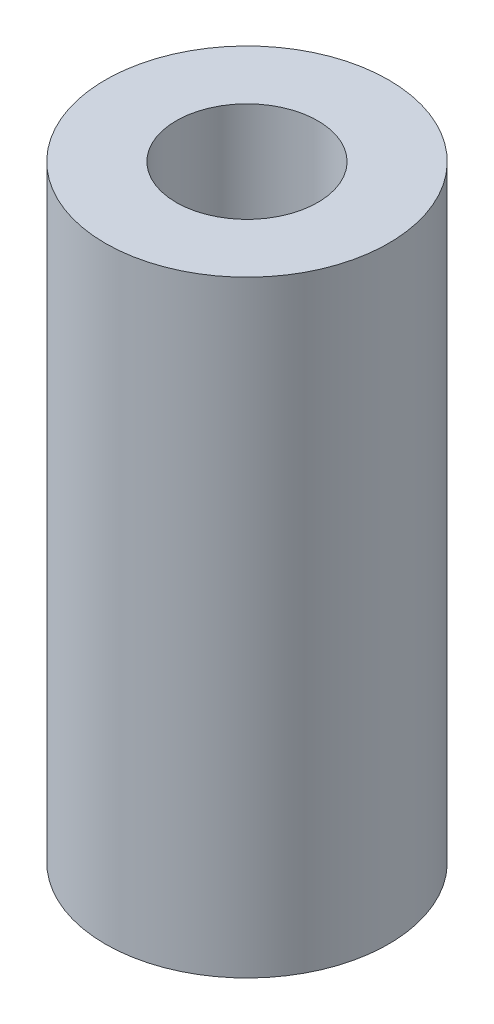
ISO-10303-21;
HEADER;
FILE_DESCRIPTION(('STEP AP214'),'2;1');
FILE_NAME('part.step','',(''),(''),'','','');
FILE_SCHEMA(('AUTOMOTIVE_DESIGN { 1 0 10303 214 1 1 1 1 }'));
ENDSEC;
DATA;
#1=APPLICATION_CONTEXT('core data for automotive mechanical design processes');
#2=APPLICATION_PROTOCOL_DEFINITION('international standard','automotive_design',2000,#1);
#3=PRODUCT_CONTEXT('',#1,'mechanical');
#4=PRODUCT('Part','Part','',(#3));
#5=PRODUCT_RELATED_PRODUCT_CATEGORY('part','',(#4));
#6=PRODUCT_DEFINITION_FORMATION('','',#4);
#7=PRODUCT_DEFINITION_CONTEXT('part definition',#1,'design');
#8=PRODUCT_DEFINITION('design','',#6,#7);
#9=PRODUCT_DEFINITION_SHAPE('','',#8);
#10=(LENGTH_UNIT() NAMED_UNIT(*) SI_UNIT(.MILLI.,.METRE.));
#11=(NAMED_UNIT(*) PLANE_ANGLE_UNIT() SI_UNIT($,.RADIAN.));
#12=(NAMED_UNIT(*) SI_UNIT($,.STERADIAN.) SOLID_ANGLE_UNIT());
#13=UNCERTAINTY_MEASURE_WITH_UNIT(LENGTH_MEASURE(1.E-05),#10,'distance_accuracy_value','');
#14=(GEOMETRIC_REPRESENTATION_CONTEXT(3) GLOBAL_UNCERTAINTY_ASSIGNED_CONTEXT((#13)) GLOBAL_UNIT_ASSIGNED_CONTEXT((#10,
#11,#12)) REPRESENTATION_CONTEXT('',''));
#15=CARTESIAN_POINT('',(0.,0.,0.));
#16=DIRECTION('',(0.,0.,1.));
#17=DIRECTION('',(1.,0.,0.));
#18=AXIS2_PLACEMENT_3D('',#15,#16,#17);
#19=CARTESIAN_POINT('',(0.,15.,0.));
#20=DIRECTION('',(0.,1.,0.));
#21=DIRECTION('',(0.,0.,1.));
#22=AXIS2_PLACEMENT_3D('',#19,#20,#21);
#23=PLANE('',#22);
#24=CARTESIAN_POINT('',(0.,15.,0.));
#25=DIRECTION('',(0.,1.,0.));
#26=DIRECTION('',(0.,0.,1.));
#27=AXIS2_PLACEMENT_3D('',#24,#25,#26);
#28=CIRCLE('',#27,3.5);
#29=CARTESIAN_POINT('',(0.,15.,3.5));
#30=VERTEX_POINT('',#29);
#31=EDGE_CURVE('E10',#30,#30,#28,.T.);
#32=ORIENTED_EDGE('',*,*,#31,.T.);
#33=EDGE_LOOP('',(#32));
#34=FACE_BOUND('',#33,.T.);
#35=CARTESIAN_POINT('',(0.,15.,0.));
#36=DIRECTION('',(0.,1.,0.));
#37=DIRECTION('',(0.,0.,1.));
#38=AXIS2_PLACEMENT_3D('',#35,#36,#37);
#39=CIRCLE('',#38,1.75);
#40=CARTESIAN_POINT('',(0.,15.,1.75));
#41=VERTEX_POINT('',#40);
#42=EDGE_CURVE('E50',#41,#41,#39,.T.);
#43=ORIENTED_EDGE('',*,*,#42,.F.);
#44=EDGE_LOOP('',(#43));
#45=FACE_BOUND('',#44,.T.);
#46=ADVANCED_FACE('F37',(#34,#45),#23,.T.);
#47=CARTESIAN_POINT('',(0.,0.,0.));
#48=DIRECTION('',(0.,1.,0.));
#49=DIRECTION('',(0.,0.,1.));
#50=AXIS2_PLACEMENT_3D('',#47,#48,#49);
#51=PLANE('',#50);
#52=CARTESIAN_POINT('',(0.,0.,0.));
#53=DIRECTION('',(0.,1.,0.));
#54=DIRECTION('',(0.,0.,1.));
#55=AXIS2_PLACEMENT_3D('',#52,#53,#54);
#56=CIRCLE('',#55,3.5);
#57=CARTESIAN_POINT('',(0.,0.,3.5));
#58=VERTEX_POINT('',#57);
#59=EDGE_CURVE('E41',#58,#58,#56,.T.);
#60=ORIENTED_EDGE('',*,*,#59,.F.);
#61=EDGE_LOOP('',(#60));
#62=FACE_BOUND('',#61,.T.);
#63=CARTESIAN_POINT('',(0.,0.,0.));
#64=DIRECTION('',(0.,1.,0.));
#65=DIRECTION('',(0.,0.,1.));
#66=AXIS2_PLACEMENT_3D('',#63,#64,#65);
#67=CIRCLE('',#66,1.75);
#68=CARTESIAN_POINT('',(0.,0.,1.75));
#69=VERTEX_POINT('',#68);
#70=EDGE_CURVE('E52',#69,#69,#67,.T.);
#71=ORIENTED_EDGE('',*,*,#70,.T.);
#72=EDGE_LOOP('',(#71));
#73=FACE_BOUND('',#72,.T.);
#74=ADVANCED_FACE('F64',(#62,#73),#51,.F.);
#75=CARTESIAN_POINT('',(0.,15.,0.));
#76=DIRECTION('',(0.,-1.,0.));
#77=DIRECTION('',(0.,0.,-1.));
#78=AXIS2_PLACEMENT_3D('',#75,#76,#77);
#79=CYLINDRICAL_SURFACE('',#78,3.5);
#80=ORIENTED_EDGE('',*,*,#31,.F.);
#81=EDGE_LOOP('',(#80));
#82=FACE_BOUND('',#81,.T.);
#83=ORIENTED_EDGE('',*,*,#59,.T.);
#84=EDGE_LOOP('',(#83));
#85=FACE_BOUND('',#84,.T.);
#86=ADVANCED_FACE('F39',(#82,#85),#79,.T.);
#87=CARTESIAN_POINT('',(0.,15.,0.));
#88=DIRECTION('',(0.,-1.,0.));
#89=DIRECTION('',(0.,0.,-1.));
#90=AXIS2_PLACEMENT_3D('',#87,#88,#89);
#91=CYLINDRICAL_SURFACE('',#90,1.75);
#92=ORIENTED_EDGE('',*,*,#42,.T.);
#93=EDGE_LOOP('',(#92));
#94=FACE_BOUND('',#93,.T.);
#95=ORIENTED_EDGE('',*,*,#70,.F.);
#96=EDGE_LOOP('',(#95));
#97=FACE_BOUND('',#96,.T.);
#98=ADVANCED_FACE('F60',(#94,#97),#91,.F.);
#99=CLOSED_SHELL('',(#46,#74,#86,#98));
#100=MANIFOLD_SOLID_BREP('B2',#99);
#101=ADVANCED_BREP_SHAPE_REPRESENTATION('',(#18,#100),#14);
#102=SHAPE_DEFINITION_REPRESENTATION(#9,#101);
ENDSEC;
END-ISO-10303-21;
